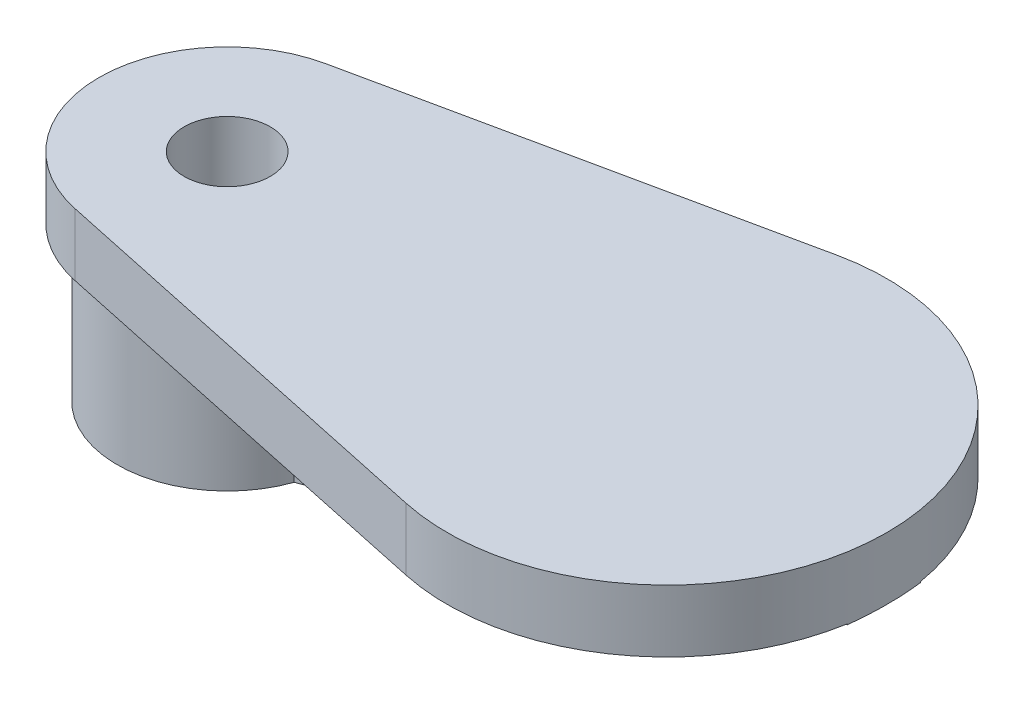
ISO-10303-21;
HEADER;
FILE_DESCRIPTION(('STEP AP214'),'2;1');
FILE_NAME('part.step','',(''),(''),'','','');
FILE_SCHEMA(('AUTOMOTIVE_DESIGN { 1 0 10303 214 1 1 1 1 }'));
ENDSEC;
DATA;
#1=APPLICATION_CONTEXT('core data for automotive mechanical design processes');
#2=APPLICATION_PROTOCOL_DEFINITION('international standard','automotive_design',2000,#1);
#3=PRODUCT_CONTEXT('',#1,'mechanical');
#4=PRODUCT('Part','Part','',(#3));
#5=PRODUCT_RELATED_PRODUCT_CATEGORY('part','',(#4));
#6=PRODUCT_DEFINITION_FORMATION('','',#4);
#7=PRODUCT_DEFINITION_CONTEXT('part definition',#1,'design');
#8=PRODUCT_DEFINITION('design','',#6,#7);
#9=PRODUCT_DEFINITION_SHAPE('','',#8);
#10=(LENGTH_UNIT() NAMED_UNIT(*) SI_UNIT(.MILLI.,.METRE.));
#11=(NAMED_UNIT(*) PLANE_ANGLE_UNIT() SI_UNIT($,.RADIAN.));
#12=(NAMED_UNIT(*) SI_UNIT($,.STERADIAN.) SOLID_ANGLE_UNIT());
#13=UNCERTAINTY_MEASURE_WITH_UNIT(LENGTH_MEASURE(1.E-05),#10,'distance_accuracy_value','');
#14=(GEOMETRIC_REPRESENTATION_CONTEXT(3) GLOBAL_UNCERTAINTY_ASSIGNED_CONTEXT((#13)) GLOBAL_UNIT_ASSIGNED_CONTEXT((#10,
#11,#12)) REPRESENTATION_CONTEXT('',''));
#15=CARTESIAN_POINT('',(0.,0.,0.));
#16=DIRECTION('',(0.,0.,1.));
#17=DIRECTION('',(1.,0.,0.));
#18=AXIS2_PLACEMENT_3D('',#15,#16,#17);
#19=CARTESIAN_POINT('',(0.,4.2,0.));
#20=DIRECTION('',(0.,1.,0.));
#21=DIRECTION('',(0.,0.,1.));
#22=AXIS2_PLACEMENT_3D('',#19,#20,#21);
#23=PLANE('',#22);
#24=DIRECTION('',(1.,0.,0.));
#25=VECTOR('',#24,1.);
#26=CARTESIAN_POINT('',(2.82842712474619,4.2,-1.));
#27=LINE('',#26,#25);
#28=CARTESIAN_POINT('',(3.35410196624968,4.2,-1.));
#29=VERTEX_POINT('',#28);
#30=CARTESIAN_POINT('',(17.9160797830996,4.2,-1.00000000000001));
#31=VERTEX_POINT('',#30);
#32=EDGE_CURVE('E126',#29,#31,#27,.T.);
#33=ORIENTED_EDGE('',*,*,#32,.F.);
#34=CARTESIAN_POINT('',(0.,4.2,0.));
#35=DIRECTION('',(0.,1.,0.));
#36=DIRECTION('',(0.,0.,1.));
#37=AXIS2_PLACEMENT_3D('',#34,#35,#36);
#38=CIRCLE('',#37,3.5);
#39=CARTESIAN_POINT('',(-0.729166666666667,4.2,-3.42320259000577));
#40=VERTEX_POINT('',#39);
#41=EDGE_CURVE('E159',#29,#40,#38,.T.);
#42=ORIENTED_EDGE('',*,*,#41,.T.);
#43=DIRECTION('',(-0.978057882858792,0.,0.208333333333334));
#44=VECTOR('',#43,1.);
#45=CARTESIAN_POINT('',(-0.729166666666667,4.2,-3.42320259000577));
#46=LINE('',#45,#44);
#47=CARTESIAN_POINT('',(10.75,4.2,-5.86834729715275));
#48=VERTEX_POINT('',#47);
#49=EDGE_CURVE('E246',#48,#40,#46,.T.);
#50=ORIENTED_EDGE('',*,*,#49,.F.);
#51=CARTESIAN_POINT('',(12.,4.2,0.));
#52=DIRECTION('',(0.,1.,0.));
#53=DIRECTION('',(0.,0.,1.));
#54=AXIS2_PLACEMENT_3D('',#51,#52,#53);
#55=CIRCLE('',#54,6.);
#56=EDGE_CURVE('E218',#31,#48,#55,.T.);
#57=ORIENTED_EDGE('',*,*,#56,.F.);
#58=EDGE_LOOP('',(#33,#42,#50,#57));
#59=FACE_BOUND('',#58,.T.);
#60=ADVANCED_FACE('F39',(#59),#23,.F.);
#61=CARTESIAN_POINT('',(0.,5.9,0.));
#62=DIRECTION('',(0.,-1.,0.));
#63=DIRECTION('',(0.,0.,-1.));
#64=AXIS2_PLACEMENT_3D('',#61,#62,#63);
#65=CYLINDRICAL_SURFACE('',#64,3.);
#66=DIRECTION('',(0.,1.,0.));
#67=VECTOR('',#66,1.);
#68=CARTESIAN_POINT('',(2.82842712474619,-15.3028305717974,1.));
#69=LINE('',#68,#67);
#70=CARTESIAN_POINT('',(2.82842712474619,0.,1.));
#71=VERTEX_POINT('',#70);
#72=CARTESIAN_POINT('',(2.82842712474619,3.7,1.));
#73=VERTEX_POINT('',#72);
#74=EDGE_CURVE('E136',#71,#73,#69,.T.);
#75=ORIENTED_EDGE('',*,*,#74,.T.);
#76=CARTESIAN_POINT('',(0.,3.70000000000001,0.));
#77=DIRECTION('',(0.,1.,0.));
#78=DIRECTION('',(0.,0.,1.));
#79=AXIS2_PLACEMENT_3D('',#76,#77,#78);
#80=CIRCLE('',#79,3.);
#81=CARTESIAN_POINT('',(2.82842712474619,3.7,-1.));
#82=VERTEX_POINT('',#81);
#83=EDGE_CURVE('E54',#73,#82,#80,.F.);
#84=ORIENTED_EDGE('',*,*,#83,.T.);
#85=DIRECTION('',(0.,1.,0.));
#86=VECTOR('',#85,1.);
#87=CARTESIAN_POINT('',(2.82842712474619,-15.3028305717974,-1.));
#88=LINE('',#87,#86);
#89=CARTESIAN_POINT('',(2.82842712474619,0.,-1.));
#90=VERTEX_POINT('',#89);
#91=EDGE_CURVE('E143',#90,#82,#88,.T.);
#92=ORIENTED_EDGE('',*,*,#91,.F.);
#93=CARTESIAN_POINT('',(0.,0.,0.));
#94=DIRECTION('',(0.,1.,0.));
#95=DIRECTION('',(0.,0.,1.));
#96=AXIS2_PLACEMENT_3D('',#93,#94,#95);
#97=CIRCLE('',#96,3.);
#98=EDGE_CURVE('E133',#90,#71,#97,.T.);
#99=ORIENTED_EDGE('',*,*,#98,.T.);
#100=EDGE_LOOP('',(#75,#84,#92,#99));
#101=FACE_BOUND('',#100,.T.);
#102=ADVANCED_FACE('F142',(#101),#65,.T.);
#103=DIRECTION('',(0.978057882858792,0.,0.208333333333333));
#104=VECTOR('',#103,1.);
#105=CARTESIAN_POINT('',(-0.729166666666667,4.2,3.42320259000577));
#106=LINE('',#105,#104);
#107=CARTESIAN_POINT('',(-0.729166666666667,4.2,3.42320259000577));
#108=VERTEX_POINT('',#107);
#109=CARTESIAN_POINT('',(10.75,4.2,5.86834729715275));
#110=VERTEX_POINT('',#109);
#111=EDGE_CURVE('E229',#108,#110,#106,.T.);
#112=ORIENTED_EDGE('',*,*,#111,.F.);
#113=CARTESIAN_POINT('',(0.,4.2,0.));
#114=DIRECTION('',(0.,1.,0.));
#115=DIRECTION('',(0.,0.,1.));
#116=AXIS2_PLACEMENT_3D('',#113,#114,#115);
#117=CIRCLE('',#116,3.5);
#118=CARTESIAN_POINT('',(3.35410196624968,4.2,1.));
#119=VERTEX_POINT('',#118);
#120=EDGE_CURVE('E150',#108,#119,#117,.T.);
#121=ORIENTED_EDGE('',*,*,#120,.T.);
#122=DIRECTION('',(-1.,0.,0.));
#123=VECTOR('',#122,1.);
#124=CARTESIAN_POINT('',(2.82842712474619,4.2,1.));
#125=LINE('',#124,#123);
#126=CARTESIAN_POINT('',(17.9160797830996,4.2,1.));
#127=VERTEX_POINT('',#126);
#128=EDGE_CURVE('E140',#127,#119,#125,.T.);
#129=ORIENTED_EDGE('',*,*,#128,.F.);
#130=EDGE_CURVE('E242',#110,#127,#55,.T.);
#131=ORIENTED_EDGE('',*,*,#130,.F.);
#132=EDGE_LOOP('',(#112,#121,#129,#131));
#133=FACE_BOUND('',#132,.T.);
#134=ADVANCED_FACE('F178',(#133),#23,.F.);
#135=CARTESIAN_POINT('',(0.,5.9,0.));
#136=DIRECTION('',(0.,1.,0.));
#137=DIRECTION('',(0.,0.,1.));
#138=AXIS2_PLACEMENT_3D('',#135,#136,#137);
#139=PLANE('',#138);
#140=CARTESIAN_POINT('',(0.,5.9,0.));
#141=DIRECTION('',(0.,1.,0.));
#142=DIRECTION('',(0.,0.,1.));
#143=AXIS2_PLACEMENT_3D('',#140,#141,#142);
#144=CIRCLE('',#143,1.175);
#145=CARTESIAN_POINT('',(0.,5.9,1.175));
#146=VERTEX_POINT('',#145);
#147=EDGE_CURVE('E146',#146,#146,#144,.T.);
#148=ORIENTED_EDGE('',*,*,#147,.F.);
#149=EDGE_LOOP('',(#148));
#150=FACE_BOUND('',#149,.T.);
#151=CARTESIAN_POINT('',(0.,5.9,0.));
#152=DIRECTION('',(0.,1.,0.));
#153=DIRECTION('',(0.,0.,1.));
#154=AXIS2_PLACEMENT_3D('',#151,#152,#153);
#155=CIRCLE('',#154,3.5);
#156=CARTESIAN_POINT('',(-0.729166666666667,5.9,-3.42320259000577));
#157=VERTEX_POINT('',#156);
#158=CARTESIAN_POINT('',(-0.729166666666667,5.9,3.42320259000577));
#159=VERTEX_POINT('',#158);
#160=EDGE_CURVE('E251',#157,#159,#155,.T.);
#161=ORIENTED_EDGE('',*,*,#160,.T.);
#162=DIRECTION('',(0.978057882858792,0.,0.208333333333333));
#163=VECTOR('',#162,1.);
#164=CARTESIAN_POINT('',(-0.729166666666667,5.9,3.42320259000577));
#165=LINE('',#164,#163);
#166=CARTESIAN_POINT('',(10.75,5.9,5.86834729715275));
#167=VERTEX_POINT('',#166);
#168=EDGE_CURVE('E255',#159,#167,#165,.T.);
#169=ORIENTED_EDGE('',*,*,#168,.T.);
#170=CARTESIAN_POINT('',(12.,5.9,0.));
#171=DIRECTION('',(0.,1.,0.));
#172=DIRECTION('',(0.,0.,1.));
#173=AXIS2_PLACEMENT_3D('',#170,#171,#172);
#174=CIRCLE('',#173,6.);
#175=CARTESIAN_POINT('',(10.75,5.9,-5.86834729715275));
#176=VERTEX_POINT('',#175);
#177=EDGE_CURVE('E237',#167,#176,#174,.T.);
#178=ORIENTED_EDGE('',*,*,#177,.T.);
#179=DIRECTION('',(-0.978057882858792,0.,0.208333333333334));
#180=VECTOR('',#179,1.);
#181=CARTESIAN_POINT('',(-0.729166666666667,5.9,-3.42320259000577));
#182=LINE('',#181,#180);
#183=EDGE_CURVE('E230',#176,#157,#182,.T.);
#184=ORIENTED_EDGE('',*,*,#183,.T.);
#185=EDGE_LOOP('',(#161,#169,#178,#184));
#186=FACE_BOUND('',#185,.T.);
#187=ADVANCED_FACE('F181',(#150,#186),#139,.T.);
#188=CARTESIAN_POINT('',(0.,0.,0.));
#189=DIRECTION('',(0.,1.,0.));
#190=DIRECTION('',(0.,0.,1.));
#191=AXIS2_PLACEMENT_3D('',#188,#189,#190);
#192=PLANE('',#191);
#193=ORIENTED_EDGE('',*,*,#98,.F.);
#194=DIRECTION('',(0.,0.,1.));
#195=VECTOR('',#194,1.);
#196=CARTESIAN_POINT('',(2.82842712474619,0.,-6.));
#197=LINE('',#196,#195);
#198=EDGE_CURVE('E120',#90,#71,#197,.T.);
#199=ORIENTED_EDGE('',*,*,#198,.T.);
#200=EDGE_LOOP('',(#193,#199));
#201=FACE_BOUND('',#200,.T.);
#202=CARTESIAN_POINT('',(0.,0.,0.));
#203=DIRECTION('',(0.,1.,0.));
#204=DIRECTION('',(0.,0.,1.));
#205=AXIS2_PLACEMENT_3D('',#202,#203,#204);
#206=CIRCLE('',#205,1.175);
#207=CARTESIAN_POINT('',(0.,0.,1.175));
#208=VERTEX_POINT('',#207);
#209=EDGE_CURVE('E153',#208,#208,#206,.T.);
#210=ORIENTED_EDGE('',*,*,#209,.T.);
#211=EDGE_LOOP('',(#210));
#212=FACE_BOUND('',#211,.T.);
#213=ADVANCED_FACE('F130',(#201,#212),#192,.F.);
#214=CARTESIAN_POINT('',(0.,5.9,0.));
#215=DIRECTION('',(0.,-1.,0.));
#216=DIRECTION('',(0.,0.,-1.));
#217=AXIS2_PLACEMENT_3D('',#214,#215,#216);
#218=CYLINDRICAL_SURFACE('',#217,1.175);
#219=ORIENTED_EDGE('',*,*,#147,.T.);
#220=EDGE_LOOP('',(#219));
#221=FACE_BOUND('',#220,.T.);
#222=ORIENTED_EDGE('',*,*,#209,.F.);
#223=EDGE_LOOP('',(#222));
#224=FACE_BOUND('',#223,.T.);
#225=ADVANCED_FACE('F197',(#221,#224),#218,.F.);
#226=CARTESIAN_POINT('',(0.,4.2,0.));
#227=DIRECTION('',(0.,1.,0.));
#228=DIRECTION('',(0.,0.,1.));
#229=AXIS2_PLACEMENT_3D('',#226,#227,#228);
#230=CYLINDRICAL_SURFACE('',#229,3.5);
#231=ORIENTED_EDGE('',*,*,#160,.F.);
#232=DIRECTION('',(0.,1.,0.));
#233=VECTOR('',#232,1.);
#234=CARTESIAN_POINT('',(-0.729166666666667,4.2,-3.42320259000577));
#235=LINE('',#234,#233);
#236=EDGE_CURVE('E262',#40,#157,#235,.T.);
#237=ORIENTED_EDGE('',*,*,#236,.F.);
#238=CARTESIAN_POINT('',(0.,4.2,0.));
#239=DIRECTION('',(0.,1.,0.));
#240=DIRECTION('',(0.,0.,1.));
#241=AXIS2_PLACEMENT_3D('',#238,#239,#240);
#242=CIRCLE('',#241,3.5);
#243=EDGE_CURVE('E227',#40,#108,#242,.T.);
#244=ORIENTED_EDGE('',*,*,#243,.T.);
#245=DIRECTION('',(0.,1.,0.));
#246=VECTOR('',#245,1.);
#247=CARTESIAN_POINT('',(-0.729166666666667,4.2,3.42320259000577));
#248=LINE('',#247,#246);
#249=EDGE_CURVE('E250',#108,#159,#248,.T.);
#250=ORIENTED_EDGE('',*,*,#249,.T.);
#251=EDGE_LOOP('',(#231,#237,#244,#250));
#252=FACE_BOUND('',#251,.T.);
#253=ADVANCED_FACE('F187',(#252),#230,.T.);
#254=CARTESIAN_POINT('',(-0.729166666666667,4.2,-3.42320259000577));
#255=DIRECTION('',(-0.208333333333334,0.,-0.978057882858792));
#256=DIRECTION('',(-0.978057882858792,0.,0.208333333333334));
#257=AXIS2_PLACEMENT_3D('',#254,#255,#256);
#258=PLANE('',#257);
#259=ORIENTED_EDGE('',*,*,#183,.F.);
#260=DIRECTION('',(0.,1.,0.));
#261=VECTOR('',#260,1.);
#262=CARTESIAN_POINT('',(10.75,4.2,-5.86834729715275));
#263=LINE('',#262,#261);
#264=EDGE_CURVE('E265',#48,#176,#263,.T.);
#265=ORIENTED_EDGE('',*,*,#264,.F.);
#266=ORIENTED_EDGE('',*,*,#49,.T.);
#267=ORIENTED_EDGE('',*,*,#236,.T.);
#268=EDGE_LOOP('',(#259,#265,#266,#267));
#269=FACE_BOUND('',#268,.T.);
#270=ADVANCED_FACE('F183',(#269),#258,.T.);
#271=CARTESIAN_POINT('',(12.,4.2,0.));
#272=DIRECTION('',(0.,1.,0.));
#273=DIRECTION('',(0.,0.,1.));
#274=AXIS2_PLACEMENT_3D('',#271,#272,#273);
#275=CYLINDRICAL_SURFACE('',#274,6.);
#276=DIRECTION('',(0.,1.,0.));
#277=VECTOR('',#276,1.);
#278=CARTESIAN_POINT('',(17.9160797830996,-15.3028305717974,1.));
#279=LINE('',#278,#277);
#280=CARTESIAN_POINT('',(17.9160797830996,4.17676807053034,1.));
#281=VERTEX_POINT('',#280);
#282=EDGE_CURVE('E139',#281,#127,#279,.T.);
#283=ORIENTED_EDGE('',*,*,#282,.F.);
#284=CARTESIAN_POINT('',(12.,2.53899884954556,0.));
#285=DIRECTION('',(-0.266798923348903,0.963752216339795,0.));
#286=DIRECTION('',(0.963752216339795,0.266798923348903,0.));
#287=AXIS2_PLACEMENT_3D('',#284,#285,#286);
#288=ELLIPSE('',#287,6.2256666166613,6.);
#289=CARTESIAN_POINT('',(17.9160797830996,4.17676807053035,-1.00000000000001));
#290=VERTEX_POINT('',#289);
#291=EDGE_CURVE('E123',#290,#281,#288,.F.);
#292=ORIENTED_EDGE('',*,*,#291,.F.);
#293=DIRECTION('',(0.,1.,0.));
#294=VECTOR('',#293,1.);
#295=CARTESIAN_POINT('',(17.9160797830996,-15.3028305717974,-1.00000000000001));
#296=LINE('',#295,#294);
#297=EDGE_CURVE('E279',#290,#31,#296,.T.);
#298=ORIENTED_EDGE('',*,*,#297,.T.);
#299=ORIENTED_EDGE('',*,*,#56,.T.);
#300=ORIENTED_EDGE('',*,*,#264,.T.);
#301=ORIENTED_EDGE('',*,*,#177,.F.);
#302=DIRECTION('',(0.,1.,0.));
#303=VECTOR('',#302,1.);
#304=CARTESIAN_POINT('',(10.75,4.2,5.86834729715275));
#305=LINE('',#304,#303);
#306=EDGE_CURVE('E268',#110,#167,#305,.T.);
#307=ORIENTED_EDGE('',*,*,#306,.F.);
#308=ORIENTED_EDGE('',*,*,#130,.T.);
#309=EDGE_LOOP('',(#283,#292,#298,#299,#300,#301,#307,#308));
#310=FACE_BOUND('',#309,.T.);
#311=ADVANCED_FACE('F186',(#310),#275,.T.);
#312=CARTESIAN_POINT('',(-0.729166666666667,4.2,3.42320259000577));
#313=DIRECTION('',(-0.208333333333333,0.,0.978057882858792));
#314=DIRECTION('',(0.978057882858792,0.,0.208333333333333));
#315=AXIS2_PLACEMENT_3D('',#312,#313,#314);
#316=PLANE('',#315);
#317=ORIENTED_EDGE('',*,*,#168,.F.);
#318=ORIENTED_EDGE('',*,*,#249,.F.);
#319=ORIENTED_EDGE('',*,*,#111,.T.);
#320=ORIENTED_EDGE('',*,*,#306,.T.);
#321=EDGE_LOOP('',(#317,#318,#319,#320));
#322=FACE_BOUND('',#321,.T.);
#323=ADVANCED_FACE('F173',(#322),#316,.T.);
#324=CARTESIAN_POINT('',(2.82842712474619,-15.3028305717974,1.));
#325=DIRECTION('',(0.,0.,-1.));
#326=DIRECTION('',(-1.,0.,0.));
#327=AXIS2_PLACEMENT_3D('',#324,#325,#326);
#328=PLANE('',#327);
#329=ORIENTED_EDGE('',*,*,#128,.T.);
#330=CARTESIAN_POINT('',(3.35410196624968,4.2,1.));
#331=CARTESIAN_POINT('',(3.31045163804847,4.15816967151766,1.));
#332=CARTESIAN_POINT('',(3.26676842056955,4.11637363107233,1.));
#333=CARTESIAN_POINT('',(3.17932752519046,4.03285987665824,1.));
#334=CARTESIAN_POINT('',(3.13556984759644,3.99114216236894,1.));
#335=CARTESIAN_POINT('',(3.04797095377711,3.907794430817,1.));
#336=CARTESIAN_POINT('',(3.00412973747854,3.86616441363135,1.));
#337=CARTESIAN_POINT('',(2.91635238571837,3.78300421675456,1.));
#338=CARTESIAN_POINT('',(2.87241624986784,3.74147403747399,1.));
#339=CARTESIAN_POINT('',(2.82842712474619,3.70000000000001,1.));
#340=B_SPLINE_CURVE_WITH_KNOTS('',3,(#330,#331,#332,#333,#334,#335,#336,#337,#338,#339),
.UNSPECIFIED.,.F.,.F.,(4,2,2,2,4),(0.,0.181372965358049,0.362745186833833,0.544117567468386,
0.725490692702967),.UNSPECIFIED.);
#341=EDGE_CURVE('E68',#119,#73,#340,.T.);
#342=ORIENTED_EDGE('',*,*,#341,.T.);
#343=ORIENTED_EDGE('',*,*,#74,.F.);
#344=DIRECTION('',(0.963752216339795,0.266798923348903,0.));
#345=VECTOR('',#344,1.);
#346=CARTESIAN_POINT('',(-1.10635991619794,-1.0892809669669,1.));
#347=LINE('',#346,#345);
#348=EDGE_CURVE('E117',#71,#281,#347,.T.);
#349=ORIENTED_EDGE('',*,*,#348,.T.);
#350=ORIENTED_EDGE('',*,*,#282,.T.);
#351=EDGE_LOOP('',(#329,#342,#343,#349,#350));
#352=FACE_BOUND('',#351,.T.);
#353=ADVANCED_FACE('F137',(#352),#328,.F.);
#354=CARTESIAN_POINT('',(2.82842712474619,-15.3028305717974,-1.));
#355=DIRECTION('',(0.,0.,1.));
#356=DIRECTION('',(1.,0.,0.));
#357=AXIS2_PLACEMENT_3D('',#354,#355,#356);
#358=PLANE('',#357);
#359=ORIENTED_EDGE('',*,*,#91,.T.);
#360=CARTESIAN_POINT('',(2.82842712474619,3.70000000000001,-1.));
#361=CARTESIAN_POINT('',(2.87241624986784,3.74147403747399,-1.));
#362=CARTESIAN_POINT('',(2.91635238571837,3.78300421675456,-1.));
#363=CARTESIAN_POINT('',(3.00412973747854,3.86616441363135,-1.));
#364=CARTESIAN_POINT('',(3.04797095377711,3.907794430817,-1.));
#365=CARTESIAN_POINT('',(3.13556984759643,3.99114216236894,-1.));
#366=CARTESIAN_POINT('',(3.17932752519046,4.03285987665824,-1.));
#367=CARTESIAN_POINT('',(3.26676842056954,4.11637363107233,-1.));
#368=CARTESIAN_POINT('',(3.31045163804847,4.15816967151766,-1.));
#369=CARTESIAN_POINT('',(3.35410196624968,4.2,-1.));
#370=B_SPLINE_CURVE_WITH_KNOTS('',3,(#360,#361,#362,#363,#364,#365,#366,#367,#368,#369),
.UNSPECIFIED.,.F.,.F.,(4,2,2,2,4),(0.,0.181373125234581,0.362745505869135,0.544117727344918,
0.725490692702968),.UNSPECIFIED.);
#371=EDGE_CURVE('E11',#82,#29,#370,.T.);
#372=ORIENTED_EDGE('',*,*,#371,.T.);
#373=ORIENTED_EDGE('',*,*,#32,.T.);
#374=ORIENTED_EDGE('',*,*,#297,.F.);
#375=DIRECTION('',(-0.963752216339795,-0.266798923348903,0.));
#376=VECTOR('',#375,1.);
#377=CARTESIAN_POINT('',(-1.10635991619794,-1.0892809669669,-1.));
#378=LINE('',#377,#376);
#379=EDGE_CURVE('E145',#290,#90,#378,.T.);
#380=ORIENTED_EDGE('',*,*,#379,.T.);
#381=EDGE_LOOP('',(#359,#372,#373,#374,#380));
#382=FACE_BOUND('',#381,.T.);
#383=ADVANCED_FACE('F172',(#382),#358,.F.);
#384=CARTESIAN_POINT('',(2.82842712474619,0.,-6.));
#385=DIRECTION('',(-0.266798923348903,0.963752216339795,0.));
#386=DIRECTION('',(-0.963752216339795,-0.266798923348903,0.));
#387=AXIS2_PLACEMENT_3D('',#384,#385,#386);
#388=PLANE('',#387);
#389=ORIENTED_EDGE('',*,*,#198,.F.);
#390=ORIENTED_EDGE('',*,*,#379,.F.);
#391=ORIENTED_EDGE('',*,*,#291,.T.);
#392=ORIENTED_EDGE('',*,*,#348,.F.);
#393=EDGE_LOOP('',(#389,#390,#391,#392));
#394=FACE_BOUND('',#393,.T.);
#395=ADVANCED_FACE('F119',(#394),#388,.F.);
#396=CARTESIAN_POINT('',(0.,4.2,0.));
#397=DIRECTION('',(0.,1.,0.));
#398=DIRECTION('',(0.,0.,1.));
#399=AXIS2_PLACEMENT_3D('',#396,#397,#398);
#400=CONICAL_SURFACE('',#399,3.5,0.785398163397454);
#401=ORIENTED_EDGE('',*,*,#371,.F.);
#402=ORIENTED_EDGE('',*,*,#83,.F.);
#403=ORIENTED_EDGE('',*,*,#341,.F.);
#404=ORIENTED_EDGE('',*,*,#120,.F.);
#405=ORIENTED_EDGE('',*,*,#243,.F.);
#406=ORIENTED_EDGE('',*,*,#41,.F.);
#407=EDGE_LOOP('',(#401,#402,#403,#404,#405,#406));
#408=FACE_BOUND('',#407,.T.);
#409=ADVANCED_FACE('F41',(#408),#400,.T.);
#410=CLOSED_SHELL('',(#60,#102,#134,#187,#213,#225,#253,#270,#311,#323,#353,#383,#395,#409));
#411=MANIFOLD_SOLID_BREP('B2',#410);
#412=ADVANCED_BREP_SHAPE_REPRESENTATION('',(#18,#411),#14);
#413=SHAPE_DEFINITION_REPRESENTATION(#9,#412);
ENDSEC;
END-ISO-10303-21;
